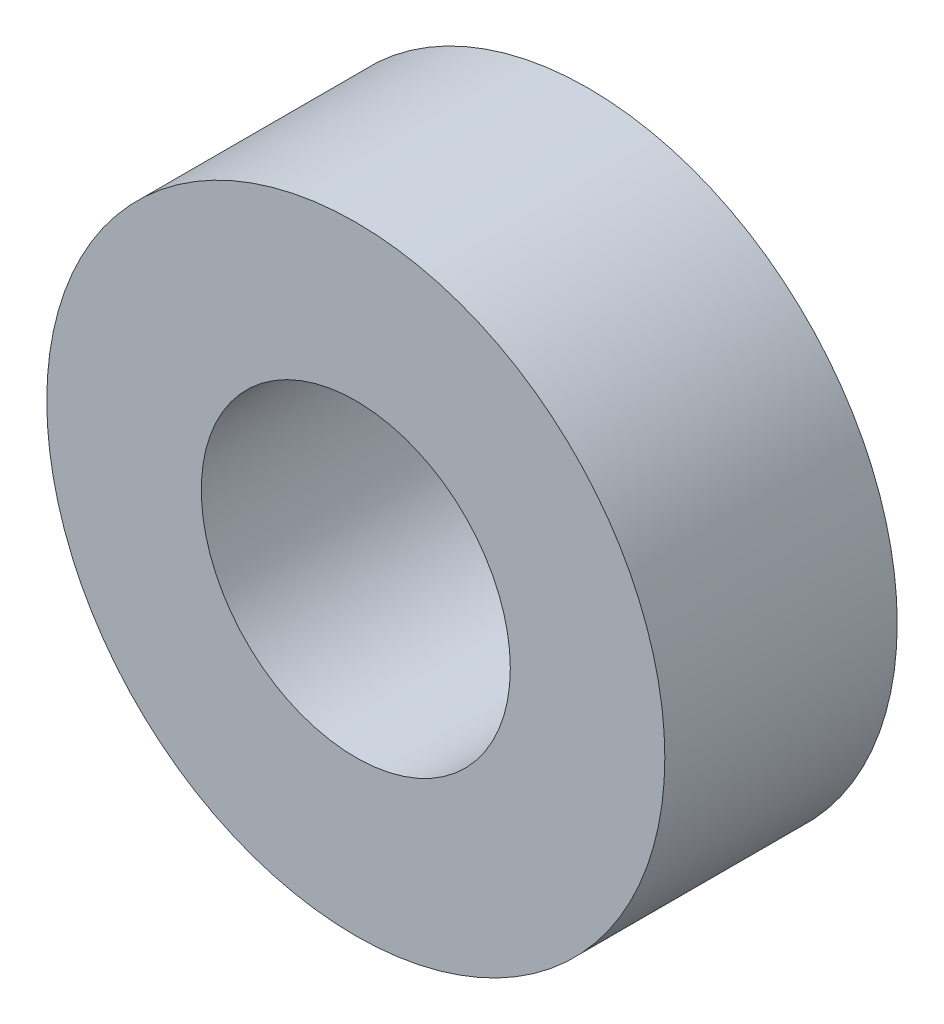
ISO-10303-21;
HEADER;
FILE_DESCRIPTION(('STEP AP214'),'2;1');
FILE_NAME('part.step','',(''),(''),'','','');
FILE_SCHEMA(('AUTOMOTIVE_DESIGN { 1 0 10303 214 1 1 1 1 }'));
ENDSEC;
DATA;
#1=APPLICATION_CONTEXT('core data for automotive mechanical design processes');
#2=APPLICATION_PROTOCOL_DEFINITION('international standard','automotive_design',2000,#1);
#3=PRODUCT_CONTEXT('',#1,'mechanical');
#4=PRODUCT('Part','Part','',(#3));
#5=PRODUCT_RELATED_PRODUCT_CATEGORY('part','',(#4));
#6=PRODUCT_DEFINITION_FORMATION('','',#4);
#7=PRODUCT_DEFINITION_CONTEXT('part definition',#1,'design');
#8=PRODUCT_DEFINITION('design','',#6,#7);
#9=PRODUCT_DEFINITION_SHAPE('','',#8);
#10=(LENGTH_UNIT() NAMED_UNIT(*) SI_UNIT(.MILLI.,.METRE.));
#11=(NAMED_UNIT(*) PLANE_ANGLE_UNIT() SI_UNIT($,.RADIAN.));
#12=(NAMED_UNIT(*) SI_UNIT($,.STERADIAN.) SOLID_ANGLE_UNIT());
#13=UNCERTAINTY_MEASURE_WITH_UNIT(LENGTH_MEASURE(1.E-05),#10,'distance_accuracy_value','');
#14=(GEOMETRIC_REPRESENTATION_CONTEXT(3) GLOBAL_UNCERTAINTY_ASSIGNED_CONTEXT((#13)) GLOBAL_UNIT_ASSIGNED_CONTEXT((#10,
#11,#12)) REPRESENTATION_CONTEXT('',''));
#15=CARTESIAN_POINT('',(0.,0.,0.));
#16=DIRECTION('',(0.,0.,1.));
#17=DIRECTION('',(1.,0.,0.));
#18=AXIS2_PLACEMENT_3D('',#15,#16,#17);
#19=CARTESIAN_POINT('',(0.,0.,4.7752));
#20=DIRECTION('',(0.,0.,1.));
#21=DIRECTION('',(1.,0.,0.));
#22=AXIS2_PLACEMENT_3D('',#19,#20,#21);
#23=PLANE('',#22);
#24=CARTESIAN_POINT('',(0.,0.,4.7752));
#25=DIRECTION('',(0.,0.,1.));
#26=DIRECTION('',(1.,0.,0.));
#27=AXIS2_PLACEMENT_3D('',#24,#25,#26);
#28=CIRCLE('',#27,6.35);
#29=CARTESIAN_POINT('',(6.35,0.,4.7752));
#30=VERTEX_POINT('',#29);
#31=EDGE_CURVE('E10',#30,#30,#28,.T.);
#32=ORIENTED_EDGE('',*,*,#31,.T.);
#33=EDGE_LOOP('',(#32));
#34=FACE_BOUND('',#33,.T.);
#35=CARTESIAN_POINT('',(0.,0.,4.7752));
#36=DIRECTION('',(0.,0.,1.));
#37=DIRECTION('',(1.,0.,0.));
#38=AXIS2_PLACEMENT_3D('',#35,#36,#37);
#39=CIRCLE('',#38,3.175);
#40=CARTESIAN_POINT('',(3.175,0.,4.7752));
#41=VERTEX_POINT('',#40);
#42=EDGE_CURVE('E46',#41,#41,#39,.T.);
#43=ORIENTED_EDGE('',*,*,#42,.F.);
#44=EDGE_LOOP('',(#43));
#45=FACE_BOUND('',#44,.T.);
#46=ADVANCED_FACE('F35',(#34,#45),#23,.T.);
#47=CARTESIAN_POINT('',(0.,0.,0.));
#48=DIRECTION('',(0.,0.,1.));
#49=DIRECTION('',(1.,0.,0.));
#50=AXIS2_PLACEMENT_3D('',#47,#48,#49);
#51=PLANE('',#50);
#52=CARTESIAN_POINT('',(0.,0.,0.));
#53=DIRECTION('',(0.,0.,1.));
#54=DIRECTION('',(1.,0.,0.));
#55=AXIS2_PLACEMENT_3D('',#52,#53,#54);
#56=CIRCLE('',#55,6.35);
#57=CARTESIAN_POINT('',(6.35,0.,0.));
#58=VERTEX_POINT('',#57);
#59=EDGE_CURVE('E39',#58,#58,#56,.T.);
#60=ORIENTED_EDGE('',*,*,#59,.F.);
#61=EDGE_LOOP('',(#60));
#62=FACE_BOUND('',#61,.T.);
#63=CARTESIAN_POINT('',(0.,0.,0.));
#64=DIRECTION('',(0.,0.,1.));
#65=DIRECTION('',(1.,0.,0.));
#66=AXIS2_PLACEMENT_3D('',#63,#64,#65);
#67=CIRCLE('',#66,3.175);
#68=CARTESIAN_POINT('',(3.175,0.,0.));
#69=VERTEX_POINT('',#68);
#70=EDGE_CURVE('E48',#69,#69,#67,.T.);
#71=ORIENTED_EDGE('',*,*,#70,.T.);
#72=EDGE_LOOP('',(#71));
#73=FACE_BOUND('',#72,.T.);
#74=ADVANCED_FACE('F58',(#62,#73),#51,.F.);
#75=CARTESIAN_POINT('',(0.,0.,4.7752));
#76=DIRECTION('',(0.,0.,-1.));
#77=DIRECTION('',(-1.,0.,0.));
#78=AXIS2_PLACEMENT_3D('',#75,#76,#77);
#79=CYLINDRICAL_SURFACE('',#78,6.35);
#80=ORIENTED_EDGE('',*,*,#31,.F.);
#81=EDGE_LOOP('',(#80));
#82=FACE_BOUND('',#81,.T.);
#83=ORIENTED_EDGE('',*,*,#59,.T.);
#84=EDGE_LOOP('',(#83));
#85=FACE_BOUND('',#84,.T.);
#86=ADVANCED_FACE('F37',(#82,#85),#79,.T.);
#87=CARTESIAN_POINT('',(0.,0.,4.7752));
#88=DIRECTION('',(0.,0.,-1.));
#89=DIRECTION('',(-1.,0.,0.));
#90=AXIS2_PLACEMENT_3D('',#87,#88,#89);
#91=CYLINDRICAL_SURFACE('',#90,3.175);
#92=ORIENTED_EDGE('',*,*,#42,.T.);
#93=EDGE_LOOP('',(#92));
#94=FACE_BOUND('',#93,.T.);
#95=ORIENTED_EDGE('',*,*,#70,.F.);
#96=EDGE_LOOP('',(#95));
#97=FACE_BOUND('',#96,.T.);
#98=ADVANCED_FACE('F54',(#94,#97),#91,.F.);
#99=CLOSED_SHELL('',(#46,#74,#86,#98));
#100=MANIFOLD_SOLID_BREP('B2',#99);
#101=ADVANCED_BREP_SHAPE_REPRESENTATION('',(#18,#100),#14);
#102=SHAPE_DEFINITION_REPRESENTATION(#9,#101);
ENDSEC;
END-ISO-10303-21;
